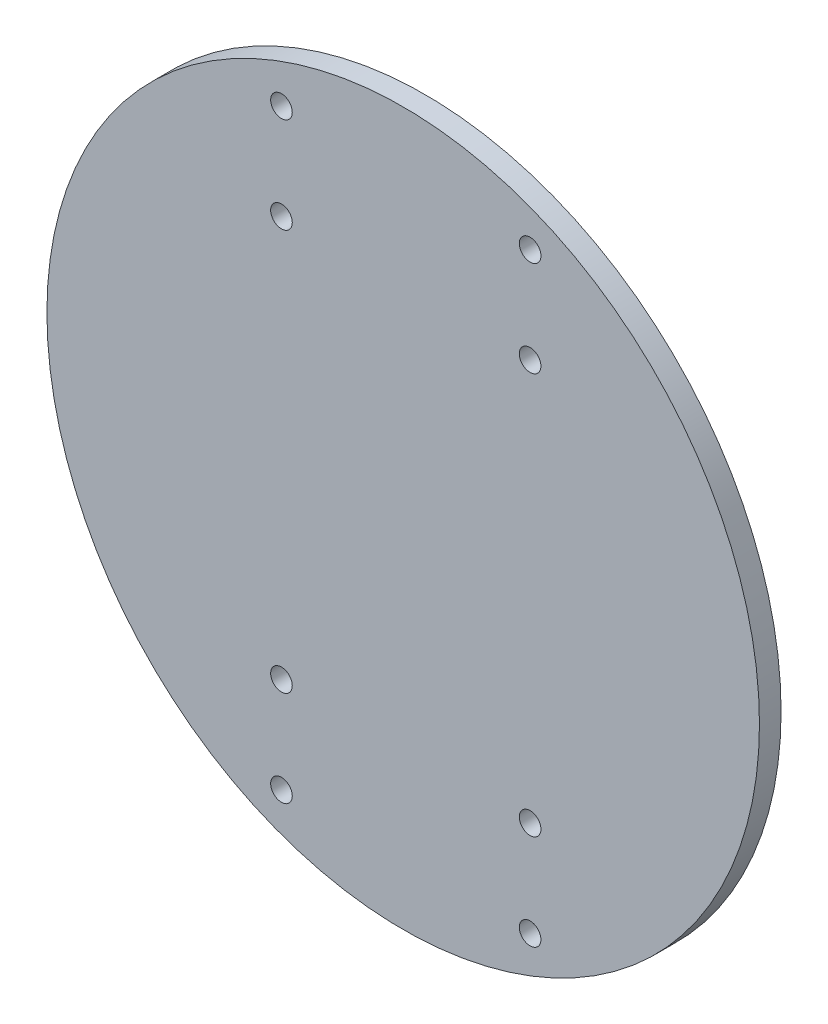
ISO-10303-21;
HEADER;
FILE_DESCRIPTION(('STEP AP214'),'2;1');
FILE_NAME('part.step','',(''),(''),'','','');
FILE_SCHEMA(('AUTOMOTIVE_DESIGN { 1 0 10303 214 1 1 1 1 }'));
ENDSEC;
DATA;
#1=APPLICATION_CONTEXT('core data for automotive mechanical design processes');
#2=APPLICATION_PROTOCOL_DEFINITION('international standard','automotive_design',2000,#1);
#3=PRODUCT_CONTEXT('',#1,'mechanical');
#4=PRODUCT('Part','Part','',(#3));
#5=PRODUCT_RELATED_PRODUCT_CATEGORY('part','',(#4));
#6=PRODUCT_DEFINITION_FORMATION('','',#4);
#7=PRODUCT_DEFINITION_CONTEXT('part definition',#1,'design');
#8=PRODUCT_DEFINITION('design','',#6,#7);
#9=PRODUCT_DEFINITION_SHAPE('','',#8);
#10=(LENGTH_UNIT() NAMED_UNIT(*) SI_UNIT(.MILLI.,.METRE.));
#11=(NAMED_UNIT(*) PLANE_ANGLE_UNIT() SI_UNIT($,.RADIAN.));
#12=(NAMED_UNIT(*) SI_UNIT($,.STERADIAN.) SOLID_ANGLE_UNIT());
#13=UNCERTAINTY_MEASURE_WITH_UNIT(LENGTH_MEASURE(1.E-05),#10,'distance_accuracy_value','');
#14=(GEOMETRIC_REPRESENTATION_CONTEXT(3) GLOBAL_UNCERTAINTY_ASSIGNED_CONTEXT((#13)) GLOBAL_UNIT_ASSIGNED_CONTEXT((#10,
#11,#12)) REPRESENTATION_CONTEXT('',''));
#15=CARTESIAN_POINT('',(0.,0.,0.));
#16=DIRECTION('',(0.,0.,1.));
#17=DIRECTION('',(1.,0.,0.));
#18=AXIS2_PLACEMENT_3D('',#15,#16,#17);
#19=CARTESIAN_POINT('',(0.,0.,5.));
#20=DIRECTION('',(0.,0.,1.));
#21=DIRECTION('',(1.,0.,0.));
#22=AXIS2_PLACEMENT_3D('',#19,#20,#21);
#23=PLANE('',#22);
#24=CARTESIAN_POINT('',(-28.16,-46.39,5.));
#25=DIRECTION('',(0.,0.,1.));
#26=DIRECTION('',(1.,0.,0.));
#27=AXIS2_PLACEMENT_3D('',#24,#25,#26);
#28=CIRCLE('',#27,2.5);
#29=CARTESIAN_POINT('',(-25.66,-46.39,5.));
#30=VERTEX_POINT('',#29);
#31=EDGE_CURVE('E58',#30,#30,#28,.F.);
#32=ORIENTED_EDGE('',*,*,#31,.T.);
#33=EDGE_LOOP('',(#32));
#34=FACE_BOUND('',#33,.T.);
#35=CARTESIAN_POINT('',(-28.16,-68.49,5.));
#36=DIRECTION('',(0.,0.,1.));
#37=DIRECTION('',(1.,0.,0.));
#38=AXIS2_PLACEMENT_3D('',#35,#36,#37);
#39=CIRCLE('',#38,2.5);
#40=CARTESIAN_POINT('',(-25.66,-68.49,5.));
#41=VERTEX_POINT('',#40);
#42=EDGE_CURVE('E73',#41,#41,#39,.F.);
#43=ORIENTED_EDGE('',*,*,#42,.T.);
#44=EDGE_LOOP('',(#43));
#45=FACE_BOUND('',#44,.T.);
#46=CARTESIAN_POINT('',(29.36,46.39,5.));
#47=DIRECTION('',(0.,0.,1.));
#48=DIRECTION('',(1.,0.,0.));
#49=AXIS2_PLACEMENT_3D('',#46,#47,#48);
#50=CIRCLE('',#49,2.5);
#51=CARTESIAN_POINT('',(31.86,46.39,5.));
#52=VERTEX_POINT('',#51);
#53=EDGE_CURVE('E76',#52,#52,#50,.T.);
#54=ORIENTED_EDGE('',*,*,#53,.F.);
#55=EDGE_LOOP('',(#54));
#56=FACE_BOUND('',#55,.T.);
#57=CARTESIAN_POINT('',(0.,0.,5.));
#58=DIRECTION('',(0.,0.,1.));
#59=DIRECTION('',(1.,0.,0.));
#60=AXIS2_PLACEMENT_3D('',#57,#58,#59);
#61=CIRCLE('',#60,82.42);
#62=CARTESIAN_POINT('',(82.42,0.,5.));
#63=VERTEX_POINT('',#62);
#64=EDGE_CURVE('E10',#63,#63,#61,.T.);
#65=ORIENTED_EDGE('',*,*,#64,.T.);
#66=EDGE_LOOP('',(#65));
#67=FACE_BOUND('',#66,.T.);
#68=CARTESIAN_POINT('',(-28.16,46.39,5.));
#69=DIRECTION('',(0.,0.,1.));
#70=DIRECTION('',(1.,0.,0.));
#71=AXIS2_PLACEMENT_3D('',#68,#69,#70);
#72=CIRCLE('',#71,2.5);
#73=CARTESIAN_POINT('',(-25.66,46.39,5.));
#74=VERTEX_POINT('',#73);
#75=EDGE_CURVE('E70',#74,#74,#72,.T.);
#76=ORIENTED_EDGE('',*,*,#75,.F.);
#77=EDGE_LOOP('',(#76));
#78=FACE_BOUND('',#77,.T.);
#79=CARTESIAN_POINT('',(29.36,68.49,5.));
#80=DIRECTION('',(0.,0.,1.));
#81=DIRECTION('',(1.,0.,0.));
#82=AXIS2_PLACEMENT_3D('',#79,#80,#81);
#83=CIRCLE('',#82,2.5);
#84=CARTESIAN_POINT('',(31.86,68.49,5.));
#85=VERTEX_POINT('',#84);
#86=EDGE_CURVE('E67',#85,#85,#83,.T.);
#87=ORIENTED_EDGE('',*,*,#86,.F.);
#88=EDGE_LOOP('',(#87));
#89=FACE_BOUND('',#88,.T.);
#90=CARTESIAN_POINT('',(-28.16,68.49,5.));
#91=DIRECTION('',(0.,0.,1.));
#92=DIRECTION('',(1.,0.,0.));
#93=AXIS2_PLACEMENT_3D('',#90,#91,#92);
#94=CIRCLE('',#93,2.5);
#95=CARTESIAN_POINT('',(-25.66,68.49,5.));
#96=VERTEX_POINT('',#95);
#97=EDGE_CURVE('E64',#96,#96,#94,.T.);
#98=ORIENTED_EDGE('',*,*,#97,.F.);
#99=EDGE_LOOP('',(#98));
#100=FACE_BOUND('',#99,.T.);
#101=CARTESIAN_POINT('',(29.36,-46.39,5.));
#102=DIRECTION('',(0.,0.,1.));
#103=DIRECTION('',(1.,0.,0.));
#104=AXIS2_PLACEMENT_3D('',#101,#102,#103);
#105=CIRCLE('',#104,2.5);
#106=CARTESIAN_POINT('',(31.86,-46.39,5.));
#107=VERTEX_POINT('',#106);
#108=EDGE_CURVE('E61',#107,#107,#105,.F.);
#109=ORIENTED_EDGE('',*,*,#108,.T.);
#110=EDGE_LOOP('',(#109));
#111=FACE_BOUND('',#110,.T.);
#112=CARTESIAN_POINT('',(29.36,-68.49,5.));
#113=DIRECTION('',(0.,0.,1.));
#114=DIRECTION('',(1.,0.,0.));
#115=AXIS2_PLACEMENT_3D('',#112,#113,#114);
#116=CIRCLE('',#115,2.5);
#117=CARTESIAN_POINT('',(31.86,-68.49,5.));
#118=VERTEX_POINT('',#117);
#119=EDGE_CURVE('E54',#118,#118,#116,.F.);
#120=ORIENTED_EDGE('',*,*,#119,.T.);
#121=EDGE_LOOP('',(#120));
#122=FACE_BOUND('',#121,.T.);
#123=ADVANCED_FACE('F43',(#34,#45,#56,#67,#78,#89,#100,#111,#122),#23,.T.);
#124=CARTESIAN_POINT('',(0.,0.,0.));
#125=DIRECTION('',(0.,0.,1.));
#126=DIRECTION('',(1.,0.,0.));
#127=AXIS2_PLACEMENT_3D('',#124,#125,#126);
#128=PLANE('',#127);
#129=CARTESIAN_POINT('',(-28.16,68.49,0.));
#130=DIRECTION('',(0.,0.,1.));
#131=DIRECTION('',(1.,0.,0.));
#132=AXIS2_PLACEMENT_3D('',#129,#130,#131);
#133=CIRCLE('',#132,2.5);
#134=CARTESIAN_POINT('',(-25.66,68.49,0.));
#135=VERTEX_POINT('',#134);
#136=EDGE_CURVE('E82',#135,#135,#133,.F.);
#137=ORIENTED_EDGE('',*,*,#136,.F.);
#138=EDGE_LOOP('',(#137));
#139=FACE_BOUND('',#138,.T.);
#140=CARTESIAN_POINT('',(29.36,68.49,0.));
#141=DIRECTION('',(0.,0.,-1.));
#142=DIRECTION('',(-1.,0.,0.));
#143=AXIS2_PLACEMENT_3D('',#140,#141,#142);
#144=CIRCLE('',#143,2.5);
#145=CARTESIAN_POINT('',(26.86,68.49,0.));
#146=VERTEX_POINT('',#145);
#147=EDGE_CURVE('E92',#146,#146,#144,.T.);
#148=ORIENTED_EDGE('',*,*,#147,.F.);
#149=EDGE_LOOP('',(#148));
#150=FACE_BOUND('',#149,.T.);
#151=CARTESIAN_POINT('',(-28.16,46.39,0.));
#152=DIRECTION('',(0.,0.,-1.));
#153=DIRECTION('',(-1.,0.,0.));
#154=AXIS2_PLACEMENT_3D('',#151,#152,#153);
#155=CIRCLE('',#154,2.5);
#156=CARTESIAN_POINT('',(-30.66,46.39,0.));
#157=VERTEX_POINT('',#156);
#158=EDGE_CURVE('E98',#157,#157,#155,.T.);
#159=ORIENTED_EDGE('',*,*,#158,.F.);
#160=EDGE_LOOP('',(#159));
#161=FACE_BOUND('',#160,.T.);
#162=CARTESIAN_POINT('',(29.36,46.39,0.));
#163=DIRECTION('',(0.,0.,1.));
#164=DIRECTION('',(1.,0.,0.));
#165=AXIS2_PLACEMENT_3D('',#162,#163,#164);
#166=CIRCLE('',#165,2.5);
#167=CARTESIAN_POINT('',(31.86,46.39,0.));
#168=VERTEX_POINT('',#167);
#169=EDGE_CURVE('E79',#168,#168,#166,.F.);
#170=ORIENTED_EDGE('',*,*,#169,.F.);
#171=EDGE_LOOP('',(#170));
#172=FACE_BOUND('',#171,.T.);
#173=CARTESIAN_POINT('',(0.,0.,0.));
#174=DIRECTION('',(0.,0.,1.));
#175=DIRECTION('',(1.,0.,0.));
#176=AXIS2_PLACEMENT_3D('',#173,#174,#175);
#177=CIRCLE('',#176,82.42);
#178=CARTESIAN_POINT('',(82.42,0.,0.));
#179=VERTEX_POINT('',#178);
#180=EDGE_CURVE('E47',#179,#179,#177,.T.);
#181=ORIENTED_EDGE('',*,*,#180,.F.);
#182=EDGE_LOOP('',(#181));
#183=FACE_BOUND('',#182,.T.);
#184=CARTESIAN_POINT('',(-28.16,-68.49,0.));
#185=DIRECTION('',(0.,0.,1.));
#186=DIRECTION('',(1.,0.,0.));
#187=AXIS2_PLACEMENT_3D('',#184,#185,#186);
#188=CIRCLE('',#187,2.5);
#189=CARTESIAN_POINT('',(-25.66,-68.49,0.));
#190=VERTEX_POINT('',#189);
#191=EDGE_CURVE('E95',#190,#190,#188,.T.);
#192=ORIENTED_EDGE('',*,*,#191,.T.);
#193=EDGE_LOOP('',(#192));
#194=FACE_BOUND('',#193,.T.);
#195=CARTESIAN_POINT('',(29.36,-46.39,0.));
#196=DIRECTION('',(0.,0.,1.));
#197=DIRECTION('',(1.,0.,0.));
#198=AXIS2_PLACEMENT_3D('',#195,#196,#197);
#199=CIRCLE('',#198,2.5);
#200=CARTESIAN_POINT('',(31.86,-46.39,0.));
#201=VERTEX_POINT('',#200);
#202=EDGE_CURVE('E83',#201,#201,#199,.T.);
#203=ORIENTED_EDGE('',*,*,#202,.T.);
#204=EDGE_LOOP('',(#203));
#205=FACE_BOUND('',#204,.T.);
#206=CARTESIAN_POINT('',(-28.16,-46.39,0.));
#207=DIRECTION('',(0.,0.,1.));
#208=DIRECTION('',(1.,0.,0.));
#209=AXIS2_PLACEMENT_3D('',#206,#207,#208);
#210=CIRCLE('',#209,2.5);
#211=CARTESIAN_POINT('',(-25.66,-46.39,0.));
#212=VERTEX_POINT('',#211);
#213=EDGE_CURVE('E86',#212,#212,#210,.T.);
#214=ORIENTED_EDGE('',*,*,#213,.T.);
#215=EDGE_LOOP('',(#214));
#216=FACE_BOUND('',#215,.T.);
#217=CARTESIAN_POINT('',(29.36,-68.49,0.));
#218=DIRECTION('',(0.,0.,1.));
#219=DIRECTION('',(1.,0.,0.));
#220=AXIS2_PLACEMENT_3D('',#217,#218,#219);
#221=CIRCLE('',#220,2.5);
#222=CARTESIAN_POINT('',(31.86,-68.49,0.));
#223=VERTEX_POINT('',#222);
#224=EDGE_CURVE('E89',#223,#223,#221,.T.);
#225=ORIENTED_EDGE('',*,*,#224,.T.);
#226=EDGE_LOOP('',(#225));
#227=FACE_BOUND('',#226,.T.);
#228=ADVANCED_FACE('F106',(#139,#150,#161,#172,#183,#194,#205,#216,#227),#128,.F.);
#229=CARTESIAN_POINT('',(0.,0.,5.));
#230=DIRECTION('',(0.,0.,-1.));
#231=DIRECTION('',(-1.,0.,0.));
#232=AXIS2_PLACEMENT_3D('',#229,#230,#231);
#233=CYLINDRICAL_SURFACE('',#232,82.42);
#234=ORIENTED_EDGE('',*,*,#64,.F.);
#235=EDGE_LOOP('',(#234));
#236=FACE_BOUND('',#235,.T.);
#237=ORIENTED_EDGE('',*,*,#180,.T.);
#238=EDGE_LOOP('',(#237));
#239=FACE_BOUND('',#238,.T.);
#240=ADVANCED_FACE('F45',(#236,#239),#233,.T.);
#241=CARTESIAN_POINT('',(29.36,46.39,10.));
#242=DIRECTION('',(0.,0.,-1.));
#243=DIRECTION('',(-1.,0.,0.));
#244=AXIS2_PLACEMENT_3D('',#241,#242,#243);
#245=CYLINDRICAL_SURFACE('',#244,2.5);
#246=ORIENTED_EDGE('',*,*,#53,.T.);
#247=EDGE_LOOP('',(#246));
#248=FACE_BOUND('',#247,.T.);
#249=ORIENTED_EDGE('',*,*,#169,.T.);
#250=EDGE_LOOP('',(#249));
#251=FACE_BOUND('',#250,.T.);
#252=ADVANCED_FACE('F145',(#248,#251),#245,.F.);
#253=CARTESIAN_POINT('',(-28.16,-68.49,10.));
#254=DIRECTION('',(0.,0.,-1.));
#255=DIRECTION('',(-1.,0.,0.));
#256=AXIS2_PLACEMENT_3D('',#253,#254,#255);
#257=CYLINDRICAL_SURFACE('',#256,2.5);
#258=ORIENTED_EDGE('',*,*,#42,.F.);
#259=EDGE_LOOP('',(#258));
#260=FACE_BOUND('',#259,.T.);
#261=ORIENTED_EDGE('',*,*,#191,.F.);
#262=EDGE_LOOP('',(#261));
#263=FACE_BOUND('',#262,.T.);
#264=ADVANCED_FACE('F148',(#260,#263),#257,.F.);
#265=CARTESIAN_POINT('',(-28.16,46.39,10.));
#266=DIRECTION('',(0.,0.,-1.));
#267=DIRECTION('',(-1.,0.,0.));
#268=AXIS2_PLACEMENT_3D('',#265,#266,#267);
#269=CYLINDRICAL_SURFACE('',#268,2.5);
#270=ORIENTED_EDGE('',*,*,#75,.T.);
#271=EDGE_LOOP('',(#270));
#272=FACE_BOUND('',#271,.T.);
#273=ORIENTED_EDGE('',*,*,#158,.T.);
#274=EDGE_LOOP('',(#273));
#275=FACE_BOUND('',#274,.T.);
#276=ADVANCED_FACE('F158',(#272,#275),#269,.F.);
#277=CARTESIAN_POINT('',(29.36,68.49,10.));
#278=DIRECTION('',(0.,0.,-1.));
#279=DIRECTION('',(-1.,0.,0.));
#280=AXIS2_PLACEMENT_3D('',#277,#278,#279);
#281=CYLINDRICAL_SURFACE('',#280,2.5);
#282=ORIENTED_EDGE('',*,*,#86,.T.);
#283=EDGE_LOOP('',(#282));
#284=FACE_BOUND('',#283,.T.);
#285=ORIENTED_EDGE('',*,*,#147,.T.);
#286=EDGE_LOOP('',(#285));
#287=FACE_BOUND('',#286,.T.);
#288=ADVANCED_FACE('F104',(#284,#287),#281,.F.);
#289=CARTESIAN_POINT('',(-28.16,68.49,10.));
#290=DIRECTION('',(0.,0.,-1.));
#291=DIRECTION('',(-1.,0.,0.));
#292=AXIS2_PLACEMENT_3D('',#289,#290,#291);
#293=CYLINDRICAL_SURFACE('',#292,2.5);
#294=ORIENTED_EDGE('',*,*,#97,.T.);
#295=EDGE_LOOP('',(#294));
#296=FACE_BOUND('',#295,.T.);
#297=ORIENTED_EDGE('',*,*,#136,.T.);
#298=EDGE_LOOP('',(#297));
#299=FACE_BOUND('',#298,.T.);
#300=ADVANCED_FACE('F151',(#296,#299),#293,.F.);
#301=CARTESIAN_POINT('',(29.36,-46.39,10.));
#302=DIRECTION('',(0.,0.,-1.));
#303=DIRECTION('',(-1.,0.,0.));
#304=AXIS2_PLACEMENT_3D('',#301,#302,#303);
#305=CYLINDRICAL_SURFACE('',#304,2.5);
#306=ORIENTED_EDGE('',*,*,#108,.F.);
#307=EDGE_LOOP('',(#306));
#308=FACE_BOUND('',#307,.T.);
#309=ORIENTED_EDGE('',*,*,#202,.F.);
#310=EDGE_LOOP('',(#309));
#311=FACE_BOUND('',#310,.T.);
#312=ADVANCED_FACE('F132',(#308,#311),#305,.F.);
#313=CARTESIAN_POINT('',(-28.16,-46.39,10.));
#314=DIRECTION('',(0.,0.,-1.));
#315=DIRECTION('',(-1.,0.,0.));
#316=AXIS2_PLACEMENT_3D('',#313,#314,#315);
#317=CYLINDRICAL_SURFACE('',#316,2.5);
#318=ORIENTED_EDGE('',*,*,#31,.F.);
#319=EDGE_LOOP('',(#318));
#320=FACE_BOUND('',#319,.T.);
#321=ORIENTED_EDGE('',*,*,#213,.F.);
#322=EDGE_LOOP('',(#321));
#323=FACE_BOUND('',#322,.T.);
#324=ADVANCED_FACE('F126',(#320,#323),#317,.F.);
#325=CARTESIAN_POINT('',(29.36,-68.49,10.));
#326=DIRECTION('',(0.,0.,-1.));
#327=DIRECTION('',(-1.,0.,0.));
#328=AXIS2_PLACEMENT_3D('',#325,#326,#327);
#329=CYLINDRICAL_SURFACE('',#328,2.5);
#330=ORIENTED_EDGE('',*,*,#119,.F.);
#331=EDGE_LOOP('',(#330));
#332=FACE_BOUND('',#331,.T.);
#333=ORIENTED_EDGE('',*,*,#224,.F.);
#334=EDGE_LOOP('',(#333));
#335=FACE_BOUND('',#334,.T.);
#336=ADVANCED_FACE('F124',(#332,#335),#329,.F.);
#337=CLOSED_SHELL('',(#123,#228,#240,#252,#264,#276,#288,#300,#312,#324,#336));
#338=MANIFOLD_SOLID_BREP('B2',#337);
#339=ADVANCED_BREP_SHAPE_REPRESENTATION('',(#18,#338),#14);
#340=SHAPE_DEFINITION_REPRESENTATION(#9,#339);
ENDSEC;
END-ISO-10303-21;
